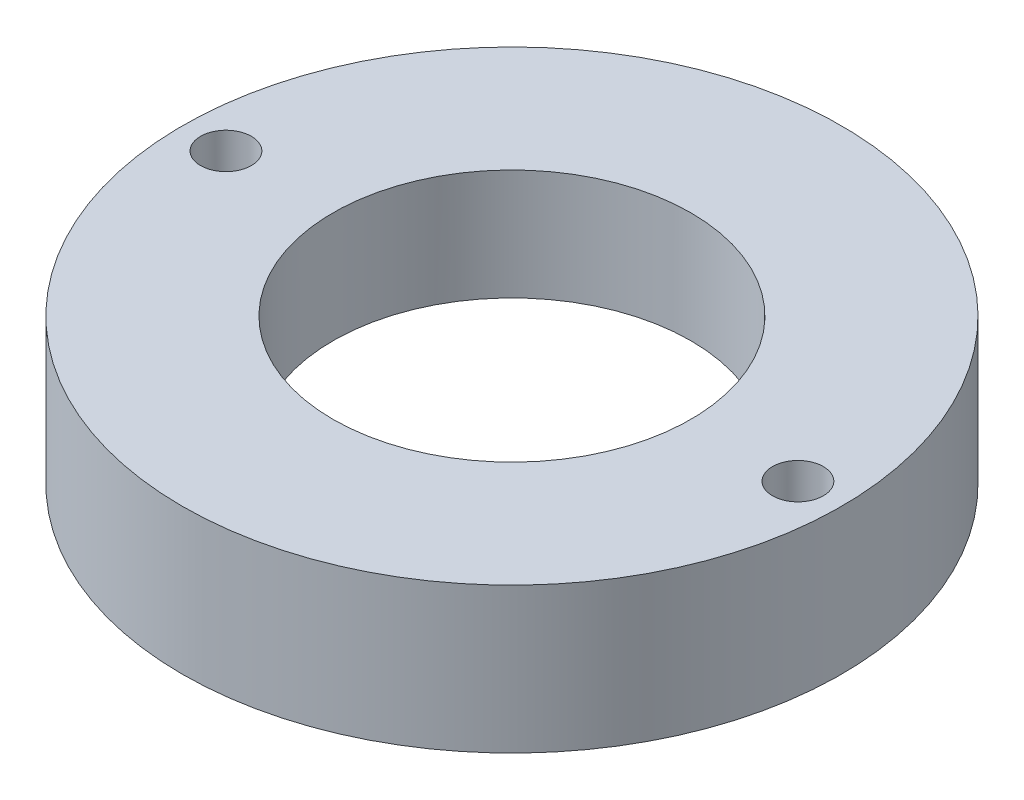
ISO-10303-21;
HEADER;
FILE_DESCRIPTION(('STEP AP214'),'2;1');
FILE_NAME('part.step','',(''),(''),'','','');
FILE_SCHEMA(('AUTOMOTIVE_DESIGN { 1 0 10303 214 1 1 1 1 }'));
ENDSEC;
DATA;
#1=APPLICATION_CONTEXT('core data for automotive mechanical design processes');
#2=APPLICATION_PROTOCOL_DEFINITION('international standard','automotive_design',2000,#1);
#3=PRODUCT_CONTEXT('',#1,'mechanical');
#4=PRODUCT('Part','Part','',(#3));
#5=PRODUCT_RELATED_PRODUCT_CATEGORY('part','',(#4));
#6=PRODUCT_DEFINITION_FORMATION('','',#4);
#7=PRODUCT_DEFINITION_CONTEXT('part definition',#1,'design');
#8=PRODUCT_DEFINITION('design','',#6,#7);
#9=PRODUCT_DEFINITION_SHAPE('','',#8);
#10=(LENGTH_UNIT() NAMED_UNIT(*) SI_UNIT(.MILLI.,.METRE.));
#11=(NAMED_UNIT(*) PLANE_ANGLE_UNIT() SI_UNIT($,.RADIAN.));
#12=(NAMED_UNIT(*) SI_UNIT($,.STERADIAN.) SOLID_ANGLE_UNIT());
#13=UNCERTAINTY_MEASURE_WITH_UNIT(LENGTH_MEASURE(1.E-05),#10,'distance_accuracy_value','');
#14=(GEOMETRIC_REPRESENTATION_CONTEXT(3) GLOBAL_UNCERTAINTY_ASSIGNED_CONTEXT((#13)) GLOBAL_UNIT_ASSIGNED_CONTEXT((#10,
#11,#12)) REPRESENTATION_CONTEXT('',''));
#15=CARTESIAN_POINT('',(0.,0.,0.));
#16=DIRECTION('',(0.,0.,1.));
#17=DIRECTION('',(1.,0.,0.));
#18=AXIS2_PLACEMENT_3D('',#15,#16,#17);
#19=CARTESIAN_POINT('',(0.,12.6,0.));
#20=DIRECTION('',(0.,-1.,0.));
#21=DIRECTION('',(0.,0.,-1.));
#22=AXIS2_PLACEMENT_3D('',#19,#20,#21);
#23=CYLINDRICAL_SURFACE('',#22,28.55);
#24=CARTESIAN_POINT('',(0.,12.6,0.));
#25=DIRECTION('',(0.,1.,0.));
#26=DIRECTION('',(0.,0.,1.));
#27=AXIS2_PLACEMENT_3D('',#24,#25,#26);
#28=CIRCLE('',#27,28.55);
#29=CARTESIAN_POINT('',(0.,12.6,28.55));
#30=VERTEX_POINT('',#29);
#31=EDGE_CURVE('E10',#30,#30,#28,.T.);
#32=ORIENTED_EDGE('',*,*,#31,.F.);
#33=EDGE_LOOP('',(#32));
#34=FACE_BOUND('',#33,.T.);
#35=CARTESIAN_POINT('',(0.,0.,0.));
#36=DIRECTION('',(0.,1.,0.));
#37=DIRECTION('',(0.,0.,1.));
#38=AXIS2_PLACEMENT_3D('',#35,#36,#37);
#39=CIRCLE('',#38,28.55);
#40=CARTESIAN_POINT('',(0.,0.,28.55));
#41=VERTEX_POINT('',#40);
#42=EDGE_CURVE('E44',#41,#41,#39,.T.);
#43=ORIENTED_EDGE('',*,*,#42,.T.);
#44=EDGE_LOOP('',(#43));
#45=FACE_BOUND('',#44,.T.);
#46=ADVANCED_FACE('F37',(#34,#45),#23,.T.);
#47=CARTESIAN_POINT('',(0.,12.6,0.));
#48=DIRECTION('',(0.,1.,0.));
#49=DIRECTION('',(0.,0.,1.));
#50=AXIS2_PLACEMENT_3D('',#47,#48,#49);
#51=PLANE('',#50);
#52=CARTESIAN_POINT('',(-24.775,12.6,0.));
#53=DIRECTION('',(0.,1.,0.));
#54=DIRECTION('',(0.,0.,1.));
#55=AXIS2_PLACEMENT_3D('',#52,#53,#54);
#56=CIRCLE('',#55,2.2);
#57=CARTESIAN_POINT('',(-24.775,12.6,2.2));
#58=VERTEX_POINT('',#57);
#59=EDGE_CURVE('E65',#58,#58,#56,.F.);
#60=ORIENTED_EDGE('',*,*,#59,.T.);
#61=EDGE_LOOP('',(#60));
#62=FACE_BOUND('',#61,.T.);
#63=CARTESIAN_POINT('',(24.775,12.6,0.));
#64=DIRECTION('',(0.,1.,0.));
#65=DIRECTION('',(0.,0.,1.));
#66=AXIS2_PLACEMENT_3D('',#63,#64,#65);
#67=CIRCLE('',#66,2.2);
#68=CARTESIAN_POINT('',(24.775,12.6,2.2));
#69=VERTEX_POINT('',#68);
#70=EDGE_CURVE('E59',#69,#69,#67,.T.);
#71=ORIENTED_EDGE('',*,*,#70,.F.);
#72=EDGE_LOOP('',(#71));
#73=FACE_BOUND('',#72,.T.);
#74=CARTESIAN_POINT('',(0.,12.6,0.));
#75=DIRECTION('',(0.,1.,0.));
#76=DIRECTION('',(0.,0.,1.));
#77=AXIS2_PLACEMENT_3D('',#74,#75,#76);
#78=CIRCLE('',#77,15.5);
#79=CARTESIAN_POINT('',(0.,12.6,15.5));
#80=VERTEX_POINT('',#79);
#81=EDGE_CURVE('E40',#80,#80,#78,.T.);
#82=ORIENTED_EDGE('',*,*,#81,.F.);
#83=EDGE_LOOP('',(#82));
#84=FACE_BOUND('',#83,.T.);
#85=ORIENTED_EDGE('',*,*,#31,.T.);
#86=EDGE_LOOP('',(#85));
#87=FACE_BOUND('',#86,.T.);
#88=ADVANCED_FACE('F89',(#62,#73,#84,#87),#51,.T.);
#89=CARTESIAN_POINT('',(0.,0.,0.));
#90=DIRECTION('',(0.,1.,0.));
#91=DIRECTION('',(0.,0.,1.));
#92=AXIS2_PLACEMENT_3D('',#89,#90,#91);
#93=PLANE('',#92);
#94=CARTESIAN_POINT('',(-24.775,0.,0.));
#95=DIRECTION('',(0.,1.,0.));
#96=DIRECTION('',(0.,0.,-1.));
#97=AXIS2_PLACEMENT_3D('',#94,#95,#96);
#98=CIRCLE('',#97,2.2);
#99=CARTESIAN_POINT('',(-24.775,0.,-2.2));
#100=VERTEX_POINT('',#99);
#101=EDGE_CURVE('E68',#100,#100,#98,.T.);
#102=ORIENTED_EDGE('',*,*,#101,.T.);
#103=EDGE_LOOP('',(#102));
#104=FACE_BOUND('',#103,.T.);
#105=CARTESIAN_POINT('',(24.775,0.,0.));
#106=DIRECTION('',(0.,-1.,0.));
#107=DIRECTION('',(0.,0.,-1.));
#108=AXIS2_PLACEMENT_3D('',#105,#106,#107);
#109=CIRCLE('',#108,2.2);
#110=CARTESIAN_POINT('',(24.775,0.,-2.2));
#111=VERTEX_POINT('',#110);
#112=EDGE_CURVE('E62',#111,#111,#109,.T.);
#113=ORIENTED_EDGE('',*,*,#112,.F.);
#114=EDGE_LOOP('',(#113));
#115=FACE_BOUND('',#114,.T.);
#116=CARTESIAN_POINT('',(0.,0.,0.));
#117=DIRECTION('',(0.,-1.,0.));
#118=DIRECTION('',(0.,0.,-1.));
#119=AXIS2_PLACEMENT_3D('',#116,#117,#118);
#120=CIRCLE('',#119,21.);
#121=CARTESIAN_POINT('',(0.,0.,-21.));
#122=VERTEX_POINT('',#121);
#123=EDGE_CURVE('E51',#122,#122,#120,.T.);
#124=ORIENTED_EDGE('',*,*,#123,.F.);
#125=EDGE_LOOP('',(#124));
#126=FACE_BOUND('',#125,.T.);
#127=ORIENTED_EDGE('',*,*,#42,.F.);
#128=EDGE_LOOP('',(#127));
#129=FACE_BOUND('',#128,.T.);
#130=ADVANCED_FACE('F72',(#104,#115,#126,#129),#93,.F.);
#131=CARTESIAN_POINT('',(0.,3.,0.));
#132=DIRECTION('',(0.,-1.,0.));
#133=DIRECTION('',(0.,0.,-1.));
#134=AXIS2_PLACEMENT_3D('',#131,#132,#133);
#135=CYLINDRICAL_SURFACE('',#134,21.);
#136=CARTESIAN_POINT('',(0.,3.,0.));
#137=DIRECTION('',(0.,-1.,0.));
#138=DIRECTION('',(0.,0.,-1.));
#139=AXIS2_PLACEMENT_3D('',#136,#137,#138);
#140=CIRCLE('',#139,21.);
#141=CARTESIAN_POINT('',(0.,3.,-21.));
#142=VERTEX_POINT('',#141);
#143=EDGE_CURVE('E49',#142,#142,#140,.T.);
#144=ORIENTED_EDGE('',*,*,#143,.F.);
#145=EDGE_LOOP('',(#144));
#146=FACE_BOUND('',#145,.T.);
#147=ORIENTED_EDGE('',*,*,#123,.T.);
#148=EDGE_LOOP('',(#147));
#149=FACE_BOUND('',#148,.T.);
#150=ADVANCED_FACE('F100',(#146,#149),#135,.F.);
#151=CARTESIAN_POINT('',(0.,3.,0.));
#152=DIRECTION('',(0.,-1.,0.));
#153=DIRECTION('',(0.,0.,-1.));
#154=AXIS2_PLACEMENT_3D('',#151,#152,#153);
#155=PLANE('',#154);
#156=CARTESIAN_POINT('',(0.,3.,0.));
#157=DIRECTION('',(0.,-1.,0.));
#158=DIRECTION('',(0.,0.,-1.));
#159=AXIS2_PLACEMENT_3D('',#156,#157,#158);
#160=CIRCLE('',#159,15.5);
#161=CARTESIAN_POINT('',(0.,3.,-15.5));
#162=VERTEX_POINT('',#161);
#163=EDGE_CURVE('E56',#162,#162,#160,.T.);
#164=ORIENTED_EDGE('',*,*,#163,.F.);
#165=EDGE_LOOP('',(#164));
#166=FACE_BOUND('',#165,.T.);
#167=ORIENTED_EDGE('',*,*,#143,.T.);
#168=EDGE_LOOP('',(#167));
#169=FACE_BOUND('',#168,.T.);
#170=ADVANCED_FACE('F103',(#166,#169),#155,.T.);
#171=CARTESIAN_POINT('',(0.,27.,0.));
#172=DIRECTION('',(0.,-1.,0.));
#173=DIRECTION('',(0.,0.,-1.));
#174=AXIS2_PLACEMENT_3D('',#171,#172,#173);
#175=CYLINDRICAL_SURFACE('',#174,15.5);
#176=ORIENTED_EDGE('',*,*,#81,.T.);
#177=EDGE_LOOP('',(#176));
#178=FACE_BOUND('',#177,.T.);
#179=ORIENTED_EDGE('',*,*,#163,.T.);
#180=EDGE_LOOP('',(#179));
#181=FACE_BOUND('',#180,.T.);
#182=ADVANCED_FACE('F84',(#178,#181),#175,.F.);
#183=CARTESIAN_POINT('',(24.775,24.,0.));
#184=DIRECTION('',(0.,-1.,0.));
#185=DIRECTION('',(0.,0.,-1.));
#186=AXIS2_PLACEMENT_3D('',#183,#184,#185);
#187=CYLINDRICAL_SURFACE('',#186,2.2);
#188=ORIENTED_EDGE('',*,*,#70,.T.);
#189=EDGE_LOOP('',(#188));
#190=FACE_BOUND('',#189,.T.);
#191=ORIENTED_EDGE('',*,*,#112,.T.);
#192=EDGE_LOOP('',(#191));
#193=FACE_BOUND('',#192,.T.);
#194=ADVANCED_FACE('F77',(#190,#193),#187,.F.);
#195=CARTESIAN_POINT('',(-24.775,24.,0.));
#196=DIRECTION('',(0.,-1.,0.));
#197=DIRECTION('',(0.,0.,-1.));
#198=AXIS2_PLACEMENT_3D('',#195,#196,#197);
#199=CYLINDRICAL_SURFACE('',#198,2.2);
#200=ORIENTED_EDGE('',*,*,#59,.F.);
#201=EDGE_LOOP('',(#200));
#202=FACE_BOUND('',#201,.T.);
#203=ORIENTED_EDGE('',*,*,#101,.F.);
#204=EDGE_LOOP('',(#203));
#205=FACE_BOUND('',#204,.T.);
#206=ADVANCED_FACE('F75',(#202,#205),#199,.F.);
#207=CLOSED_SHELL('',(#46,#88,#130,#150,#170,#182,#194,#206));
#208=MANIFOLD_SOLID_BREP('B2',#207);
#209=ADVANCED_BREP_SHAPE_REPRESENTATION('',(#18,#208),#14);
#210=SHAPE_DEFINITION_REPRESENTATION(#9,#209);
ENDSEC;
END-ISO-10303-21;
